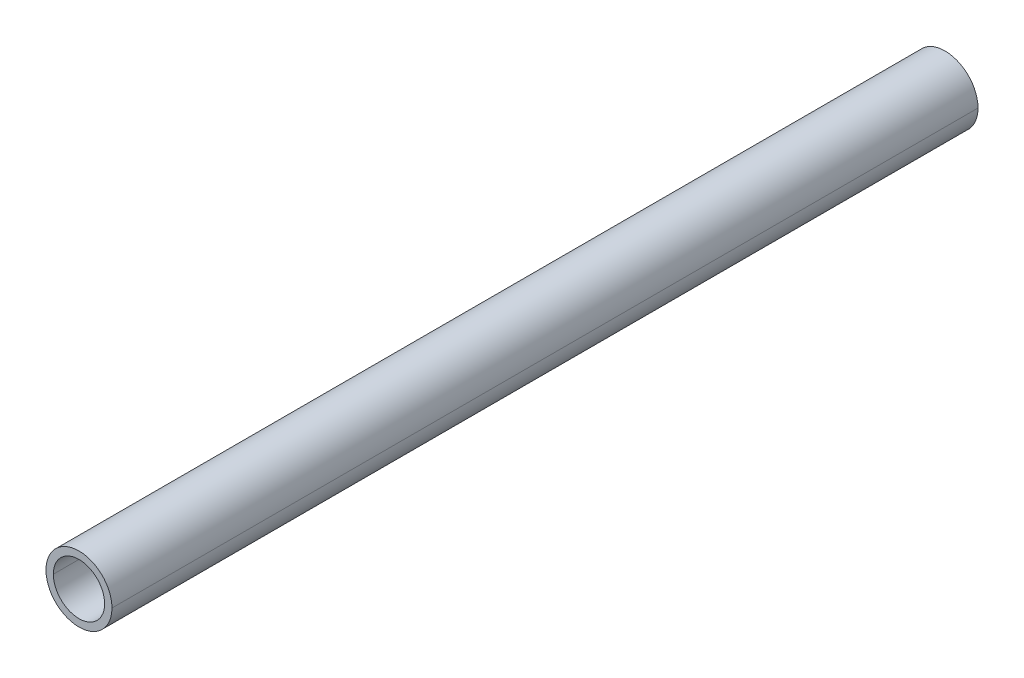
ISO-10303-21;
HEADER;
FILE_DESCRIPTION(('STEP AP214'),'2;1');
FILE_NAME('part.step','',(''),(''),'','','');
FILE_SCHEMA(('AUTOMOTIVE_DESIGN { 1 0 10303 214 1 1 1 1 }'));
ENDSEC;
DATA;
#1=APPLICATION_CONTEXT('core data for automotive mechanical design processes');
#2=APPLICATION_PROTOCOL_DEFINITION('international standard','automotive_design',2000,#1);
#3=PRODUCT_CONTEXT('',#1,'mechanical');
#4=PRODUCT('Part','Part','',(#3));
#5=PRODUCT_RELATED_PRODUCT_CATEGORY('part','',(#4));
#6=PRODUCT_DEFINITION_FORMATION('','',#4);
#7=PRODUCT_DEFINITION_CONTEXT('part definition',#1,'design');
#8=PRODUCT_DEFINITION('design','',#6,#7);
#9=PRODUCT_DEFINITION_SHAPE('','',#8);
#10=(LENGTH_UNIT() NAMED_UNIT(*) SI_UNIT(.MILLI.,.METRE.));
#11=(NAMED_UNIT(*) PLANE_ANGLE_UNIT() SI_UNIT($,.RADIAN.));
#12=(NAMED_UNIT(*) SI_UNIT($,.STERADIAN.) SOLID_ANGLE_UNIT());
#13=UNCERTAINTY_MEASURE_WITH_UNIT(LENGTH_MEASURE(1.E-05),#10,'distance_accuracy_value','');
#14=(GEOMETRIC_REPRESENTATION_CONTEXT(3) GLOBAL_UNCERTAINTY_ASSIGNED_CONTEXT((#13)) GLOBAL_UNIT_ASSIGNED_CONTEXT((#10,
#11,#12)) REPRESENTATION_CONTEXT('',''));
#15=CARTESIAN_POINT('',(0.,0.,0.));
#16=DIRECTION('',(0.,0.,1.));
#17=DIRECTION('',(1.,0.,0.));
#18=AXIS2_PLACEMENT_3D('',#15,#16,#17);
#19=CARTESIAN_POINT('',(0.,0.,236.4));
#20=DIRECTION('',(0.,0.,-1.));
#21=DIRECTION('',(-1.,0.,0.));
#22=AXIS2_PLACEMENT_3D('',#19,#20,#21);
#23=CYLINDRICAL_SURFACE('',#22,7.);
#24=DIRECTION('',(0.,0.,-1.));
#25=VECTOR('',#24,1.);
#26=CARTESIAN_POINT('',(7.,0.,236.4));
#27=LINE('',#26,#25);
#28=CARTESIAN_POINT('',(7.,0.,236.4));
#29=VERTEX_POINT('',#28);
#30=CARTESIAN_POINT('',(7.,0.,0.));
#31=VERTEX_POINT('',#30);
#32=EDGE_CURVE('E97',#29,#31,#27,.T.);
#33=ORIENTED_EDGE('',*,*,#32,.F.);
#34=CARTESIAN_POINT('',(0.,0.,236.4));
#35=DIRECTION('',(0.,0.,1.));
#36=DIRECTION('',(1.,0.,0.));
#37=AXIS2_PLACEMENT_3D('',#34,#35,#36);
#38=CIRCLE('',#37,7.);
#39=CARTESIAN_POINT('',(-7.,0.,236.4));
#40=VERTEX_POINT('',#39);
#41=EDGE_CURVE('E62',#29,#40,#38,.T.);
#42=ORIENTED_EDGE('',*,*,#41,.T.);
#43=DIRECTION('',(0.,0.,-1.));
#44=VECTOR('',#43,1.);
#45=CARTESIAN_POINT('',(-7.,0.,236.4));
#46=LINE('',#45,#44);
#47=CARTESIAN_POINT('',(-7.,0.,0.));
#48=VERTEX_POINT('',#47);
#49=EDGE_CURVE('E91',#40,#48,#46,.T.);
#50=ORIENTED_EDGE('',*,*,#49,.T.);
#51=CARTESIAN_POINT('',(0.,0.,0.));
#52=DIRECTION('',(0.,0.,1.));
#53=DIRECTION('',(1.,0.,0.));
#54=AXIS2_PLACEMENT_3D('',#51,#52,#53);
#55=CIRCLE('',#54,7.);
#56=EDGE_CURVE('E11',#31,#48,#55,.T.);
#57=ORIENTED_EDGE('',*,*,#56,.F.);
#58=EDGE_LOOP('',(#33,#42,#50,#57));
#59=FACE_BOUND('',#58,.T.);
#60=ADVANCED_FACE('F16',(#59),#23,.F.);
#61=CARTESIAN_POINT('',(0.,0.,236.4));
#62=DIRECTION('',(0.,0.,-1.));
#63=DIRECTION('',(-1.,0.,0.));
#64=AXIS2_PLACEMENT_3D('',#61,#62,#63);
#65=CYLINDRICAL_SURFACE('',#64,9.);
#66=DIRECTION('',(0.,0.,-1.));
#67=VECTOR('',#66,1.);
#68=CARTESIAN_POINT('',(9.,0.,236.4));
#69=LINE('',#68,#67);
#70=CARTESIAN_POINT('',(9.,0.,236.4));
#71=VERTEX_POINT('',#70);
#72=CARTESIAN_POINT('',(9.,0.,0.));
#73=VERTEX_POINT('',#72);
#74=EDGE_CURVE('E109',#71,#73,#69,.T.);
#75=ORIENTED_EDGE('',*,*,#74,.F.);
#76=CARTESIAN_POINT('',(0.,0.,236.4));
#77=DIRECTION('',(0.,0.,1.));
#78=DIRECTION('',(1.,0.,0.));
#79=AXIS2_PLACEMENT_3D('',#76,#77,#78);
#80=CIRCLE('',#79,9.);
#81=CARTESIAN_POINT('',(-9.,0.,236.4));
#82=VERTEX_POINT('',#81);
#83=EDGE_CURVE('E82',#82,#71,#80,.T.);
#84=ORIENTED_EDGE('',*,*,#83,.F.);
#85=DIRECTION('',(0.,0.,-1.));
#86=VECTOR('',#85,1.);
#87=CARTESIAN_POINT('',(-9.,0.,236.4));
#88=LINE('',#87,#86);
#89=CARTESIAN_POINT('',(-9.,0.,0.));
#90=VERTEX_POINT('',#89);
#91=EDGE_CURVE('E120',#82,#90,#88,.T.);
#92=ORIENTED_EDGE('',*,*,#91,.T.);
#93=CARTESIAN_POINT('',(0.,0.,0.));
#94=DIRECTION('',(0.,0.,1.));
#95=DIRECTION('',(1.,0.,0.));
#96=AXIS2_PLACEMENT_3D('',#93,#94,#95);
#97=CIRCLE('',#96,9.);
#98=EDGE_CURVE('E20',#90,#73,#97,.T.);
#99=ORIENTED_EDGE('',*,*,#98,.T.);
#100=EDGE_LOOP('',(#75,#84,#92,#99));
#101=FACE_BOUND('',#100,.T.);
#102=ADVANCED_FACE('F127',(#101),#65,.T.);
#103=CARTESIAN_POINT('',(0.,0.,0.));
#104=DIRECTION('',(0.,0.,1.));
#105=DIRECTION('',(1.,0.,0.));
#106=AXIS2_PLACEMENT_3D('',#103,#104,#105);
#107=PLANE('',#106);
#108=CARTESIAN_POINT('',(0.,0.,0.));
#109=DIRECTION('',(0.,0.,1.));
#110=DIRECTION('',(1.,0.,0.));
#111=AXIS2_PLACEMENT_3D('',#108,#109,#110);
#112=CIRCLE('',#111,7.);
#113=EDGE_CURVE('E89',#48,#31,#112,.T.);
#114=ORIENTED_EDGE('',*,*,#113,.T.);
#115=ORIENTED_EDGE('',*,*,#56,.T.);
#116=EDGE_LOOP('',(#114,#115));
#117=FACE_BOUND('',#116,.T.);
#118=ORIENTED_EDGE('',*,*,#98,.F.);
#119=CARTESIAN_POINT('',(0.,0.,0.));
#120=DIRECTION('',(0.,0.,1.));
#121=DIRECTION('',(1.,0.,0.));
#122=AXIS2_PLACEMENT_3D('',#119,#120,#121);
#123=CIRCLE('',#122,9.);
#124=EDGE_CURVE('E112',#73,#90,#123,.T.);
#125=ORIENTED_EDGE('',*,*,#124,.F.);
#126=EDGE_LOOP('',(#118,#125));
#127=FACE_BOUND('',#126,.T.);
#128=ADVANCED_FACE('F87',(#117,#127),#107,.F.);
#129=CARTESIAN_POINT('',(0.,0.,236.4));
#130=DIRECTION('',(0.,0.,1.));
#131=DIRECTION('',(1.,0.,0.));
#132=AXIS2_PLACEMENT_3D('',#129,#130,#131);
#133=PLANE('',#132);
#134=CARTESIAN_POINT('',(0.,0.,236.4));
#135=DIRECTION('',(0.,0.,1.));
#136=DIRECTION('',(1.,0.,0.));
#137=AXIS2_PLACEMENT_3D('',#134,#135,#136);
#138=CIRCLE('',#137,7.);
#139=EDGE_CURVE('E105',#40,#29,#138,.T.);
#140=ORIENTED_EDGE('',*,*,#139,.F.);
#141=ORIENTED_EDGE('',*,*,#41,.F.);
#142=EDGE_LOOP('',(#140,#141));
#143=FACE_BOUND('',#142,.T.);
#144=ORIENTED_EDGE('',*,*,#83,.T.);
#145=CARTESIAN_POINT('',(0.,0.,236.4));
#146=DIRECTION('',(0.,0.,1.));
#147=DIRECTION('',(1.,0.,0.));
#148=AXIS2_PLACEMENT_3D('',#145,#146,#147);
#149=CIRCLE('',#148,9.);
#150=EDGE_CURVE('E95',#71,#82,#149,.T.);
#151=ORIENTED_EDGE('',*,*,#150,.T.);
#152=EDGE_LOOP('',(#144,#151));
#153=FACE_BOUND('',#152,.T.);
#154=ADVANCED_FACE('F132',(#143,#153),#133,.T.);
#155=CARTESIAN_POINT('',(0.,0.,236.4));
#156=DIRECTION('',(0.,0.,-1.));
#157=DIRECTION('',(-1.,0.,0.));
#158=AXIS2_PLACEMENT_3D('',#155,#156,#157);
#159=CYLINDRICAL_SURFACE('',#158,9.);
#160=ORIENTED_EDGE('',*,*,#150,.F.);
#161=ORIENTED_EDGE('',*,*,#74,.T.);
#162=ORIENTED_EDGE('',*,*,#124,.T.);
#163=ORIENTED_EDGE('',*,*,#91,.F.);
#164=EDGE_LOOP('',(#160,#161,#162,#163));
#165=FACE_BOUND('',#164,.T.);
#166=ADVANCED_FACE('F130',(#165),#159,.T.);
#167=CARTESIAN_POINT('',(0.,0.,236.4));
#168=DIRECTION('',(0.,0.,-1.));
#169=DIRECTION('',(-1.,0.,0.));
#170=AXIS2_PLACEMENT_3D('',#167,#168,#169);
#171=CYLINDRICAL_SURFACE('',#170,7.);
#172=ORIENTED_EDGE('',*,*,#139,.T.);
#173=ORIENTED_EDGE('',*,*,#32,.T.);
#174=ORIENTED_EDGE('',*,*,#113,.F.);
#175=ORIENTED_EDGE('',*,*,#49,.F.);
#176=EDGE_LOOP('',(#172,#173,#174,#175));
#177=FACE_BOUND('',#176,.T.);
#178=ADVANCED_FACE('F18',(#177),#171,.F.);
#179=CLOSED_SHELL('',(#60,#102,#128,#154,#166,#178));
#180=MANIFOLD_SOLID_BREP('B1',#179);
#181=ADVANCED_BREP_SHAPE_REPRESENTATION('',(#18,#180),#14);
#182=SHAPE_DEFINITION_REPRESENTATION(#9,#181);
ENDSEC;
END-ISO-10303-21;
